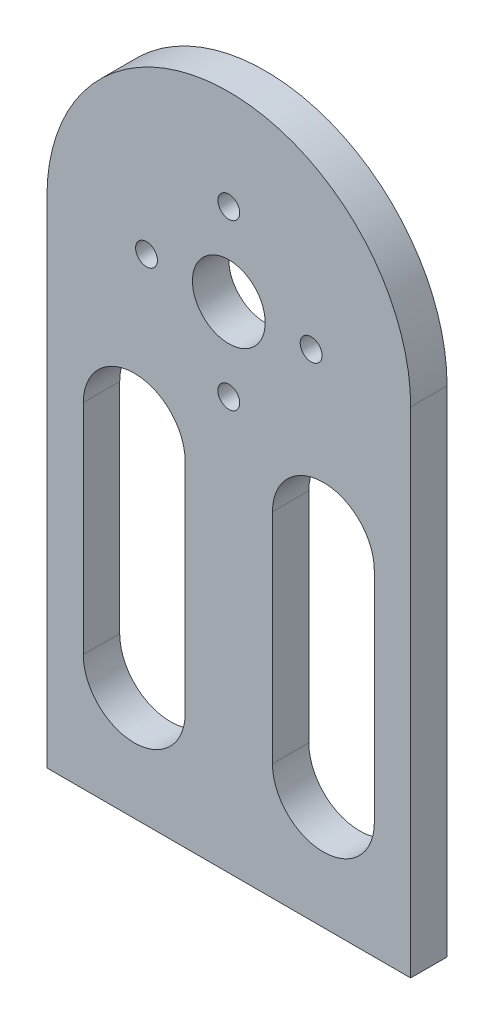
ISO-10303-21;
HEADER;
FILE_DESCRIPTION(('STEP AP214'),'2;1');
FILE_NAME('part.step','',(''),(''),'','','');
FILE_SCHEMA(('AUTOMOTIVE_DESIGN { 1 0 10303 214 1 1 1 1 }'));
ENDSEC;
DATA;
#1=APPLICATION_CONTEXT('core data for automotive mechanical design processes');
#2=APPLICATION_PROTOCOL_DEFINITION('international standard','automotive_design',2000,#1);
#3=PRODUCT_CONTEXT('',#1,'mechanical');
#4=PRODUCT('Part','Part','',(#3));
#5=PRODUCT_RELATED_PRODUCT_CATEGORY('part','',(#4));
#6=PRODUCT_DEFINITION_FORMATION('','',#4);
#7=PRODUCT_DEFINITION_CONTEXT('part definition',#1,'design');
#8=PRODUCT_DEFINITION('design','',#6,#7);
#9=PRODUCT_DEFINITION_SHAPE('','',#8);
#10=(LENGTH_UNIT() NAMED_UNIT(*) SI_UNIT(.MILLI.,.METRE.));
#11=(NAMED_UNIT(*) PLANE_ANGLE_UNIT() SI_UNIT($,.RADIAN.));
#12=(NAMED_UNIT(*) SI_UNIT($,.STERADIAN.) SOLID_ANGLE_UNIT());
#13=UNCERTAINTY_MEASURE_WITH_UNIT(LENGTH_MEASURE(1.E-05),#10,'distance_accuracy_value','');
#14=(GEOMETRIC_REPRESENTATION_CONTEXT(3) GLOBAL_UNCERTAINTY_ASSIGNED_CONTEXT((#13)) GLOBAL_UNIT_ASSIGNED_CONTEXT((#10,
#11,#12)) REPRESENTATION_CONTEXT('',''));
#15=CARTESIAN_POINT('',(0.,0.,0.));
#16=DIRECTION('',(0.,0.,1.));
#17=DIRECTION('',(1.,0.,0.));
#18=AXIS2_PLACEMENT_3D('',#15,#16,#17);
#19=CARTESIAN_POINT('',(0.,34.,2.5));
#20=DIRECTION('',(0.,0.,1.));
#21=DIRECTION('',(1.,0.,0.));
#22=AXIS2_PLACEMENT_3D('',#19,#20,#21);
#23=PLANE('',#22);
#24=CARTESIAN_POINT('',(0.,28.3431457505076,2.5));
#25=DIRECTION('',(0.,0.,1.));
#26=DIRECTION('',(1.,0.,0.));
#27=AXIS2_PLACEMENT_3D('',#24,#25,#26);
#28=CIRCLE('',#27,0.75);
#29=CARTESIAN_POINT('',(0.750000000000001,28.3431457505076,2.5));
#30=VERTEX_POINT('',#29);
#31=EDGE_CURVE('E163',#30,#30,#28,.T.);
#32=ORIENTED_EDGE('',*,*,#31,.F.);
#33=EDGE_LOOP('',(#32));
#34=FACE_BOUND('',#33,.T.);
#35=CARTESIAN_POINT('',(0.,39.6568542494924,2.5));
#36=DIRECTION('',(0.,0.,1.));
#37=DIRECTION('',(1.,0.,0.));
#38=AXIS2_PLACEMENT_3D('',#35,#36,#37);
#39=CIRCLE('',#38,0.750000000000001);
#40=CARTESIAN_POINT('',(0.750000000000001,39.6568542494924,2.5));
#41=VERTEX_POINT('',#40);
#42=EDGE_CURVE('E175',#41,#41,#39,.T.);
#43=ORIENTED_EDGE('',*,*,#42,.F.);
#44=EDGE_LOOP('',(#43));
#45=FACE_BOUND('',#44,.T.);
#46=DIRECTION('',(0.,-1.,0.));
#47=VECTOR('',#46,1.);
#48=CARTESIAN_POINT('',(-10.,23.,2.5));
#49=LINE('',#48,#47);
#50=CARTESIAN_POINT('',(-10.,23.,2.5));
#51=VERTEX_POINT('',#50);
#52=CARTESIAN_POINT('',(-10.,8.,2.5));
#53=VERTEX_POINT('',#52);
#54=EDGE_CURVE('E189',#51,#53,#49,.T.);
#55=ORIENTED_EDGE('',*,*,#54,.F.);
#56=CARTESIAN_POINT('',(-6.5,23.,2.5));
#57=DIRECTION('',(0.,0.,1.));
#58=DIRECTION('',(1.,0.,0.));
#59=AXIS2_PLACEMENT_3D('',#56,#57,#58);
#60=CIRCLE('',#59,3.5);
#61=CARTESIAN_POINT('',(-3.,23.,2.5));
#62=VERTEX_POINT('',#61);
#63=EDGE_CURVE('E187',#62,#51,#60,.T.);
#64=ORIENTED_EDGE('',*,*,#63,.F.);
#65=DIRECTION('',(0.,1.,0.));
#66=VECTOR('',#65,1.);
#67=CARTESIAN_POINT('',(-3.,23.,2.5));
#68=LINE('',#67,#66);
#69=CARTESIAN_POINT('',(-3.,8.,2.5));
#70=VERTEX_POINT('',#69);
#71=EDGE_CURVE('E195',#70,#62,#68,.T.);
#72=ORIENTED_EDGE('',*,*,#71,.F.);
#73=CARTESIAN_POINT('',(-6.5,8.,2.5));
#74=DIRECTION('',(0.,0.,1.));
#75=DIRECTION('',(1.,0.,0.));
#76=AXIS2_PLACEMENT_3D('',#73,#74,#75);
#77=CIRCLE('',#76,3.5);
#78=EDGE_CURVE('E192',#53,#70,#77,.T.);
#79=ORIENTED_EDGE('',*,*,#78,.F.);
#80=EDGE_LOOP('',(#55,#64,#72,#79));
#81=FACE_BOUND('',#80,.T.);
#82=CARTESIAN_POINT('',(0.,34.,2.5));
#83=DIRECTION('',(0.,0.,1.));
#84=DIRECTION('',(1.,0.,0.));
#85=AXIS2_PLACEMENT_3D('',#82,#83,#84);
#86=CIRCLE('',#85,12.5);
#87=CARTESIAN_POINT('',(12.5,34.,2.5));
#88=VERTEX_POINT('',#87);
#89=CARTESIAN_POINT('',(-12.5,34.,2.5));
#90=VERTEX_POINT('',#89);
#91=EDGE_CURVE('E218',#88,#90,#86,.T.);
#92=ORIENTED_EDGE('',*,*,#91,.T.);
#93=DIRECTION('',(0.,-1.,0.));
#94=VECTOR('',#93,1.);
#95=CARTESIAN_POINT('',(-12.5,34.,2.5));
#96=LINE('',#95,#94);
#97=CARTESIAN_POINT('',(-12.5,0.,2.5));
#98=VERTEX_POINT('',#97);
#99=EDGE_CURVE('E221',#90,#98,#96,.T.);
#100=ORIENTED_EDGE('',*,*,#99,.T.);
#101=DIRECTION('',(1.,0.,0.));
#102=VECTOR('',#101,1.);
#103=CARTESIAN_POINT('',(-12.5,0.,2.5));
#104=LINE('',#103,#102);
#105=CARTESIAN_POINT('',(12.5,0.,2.5));
#106=VERTEX_POINT('',#105);
#107=EDGE_CURVE('E224',#98,#106,#104,.T.);
#108=ORIENTED_EDGE('',*,*,#107,.T.);
#109=DIRECTION('',(0.,1.,0.));
#110=VECTOR('',#109,1.);
#111=CARTESIAN_POINT('',(12.5,34.,2.5));
#112=LINE('',#111,#110);
#113=EDGE_CURVE('E226',#106,#88,#112,.T.);
#114=ORIENTED_EDGE('',*,*,#113,.T.);
#115=EDGE_LOOP('',(#92,#100,#108,#114));
#116=FACE_BOUND('',#115,.T.);
#117=CARTESIAN_POINT('',(0.,34.,2.5));
#118=DIRECTION('',(0.,0.,1.));
#119=DIRECTION('',(1.,0.,0.));
#120=AXIS2_PLACEMENT_3D('',#117,#118,#119);
#121=CIRCLE('',#120,2.5);
#122=CARTESIAN_POINT('',(2.5,34.,2.5));
#123=VERTEX_POINT('',#122);
#124=EDGE_CURVE('E181',#123,#123,#121,.T.);
#125=ORIENTED_EDGE('',*,*,#124,.F.);
#126=EDGE_LOOP('',(#125));
#127=FACE_BOUND('',#126,.T.);
#128=CARTESIAN_POINT('',(5.65685424949238,34.,2.5));
#129=DIRECTION('',(0.,0.,1.));
#130=DIRECTION('',(1.,0.,0.));
#131=AXIS2_PLACEMENT_3D('',#128,#129,#130);
#132=CIRCLE('',#131,0.75);
#133=CARTESIAN_POINT('',(6.40685424949238,34.,2.5));
#134=VERTEX_POINT('',#133);
#135=EDGE_CURVE('E169',#134,#134,#132,.T.);
#136=ORIENTED_EDGE('',*,*,#135,.F.);
#137=EDGE_LOOP('',(#136));
#138=FACE_BOUND('',#137,.T.);
#139=CARTESIAN_POINT('',(-5.65685424949238,34.,2.5));
#140=DIRECTION('',(0.,0.,1.));
#141=DIRECTION('',(1.,0.,0.));
#142=AXIS2_PLACEMENT_3D('',#139,#140,#141);
#143=CIRCLE('',#142,0.750000000000003);
#144=CARTESIAN_POINT('',(-4.90685424949238,34.,2.5));
#145=VERTEX_POINT('',#144);
#146=EDGE_CURVE('E157',#145,#145,#143,.T.);
#147=ORIENTED_EDGE('',*,*,#146,.F.);
#148=EDGE_LOOP('',(#147));
#149=FACE_BOUND('',#148,.T.);
#150=DIRECTION('',(0.,-1.,0.));
#151=VECTOR('',#150,1.);
#152=CARTESIAN_POINT('',(3.,23.,2.5));
#153=LINE('',#152,#151);
#154=CARTESIAN_POINT('',(3.,23.,2.5));
#155=VERTEX_POINT('',#154);
#156=CARTESIAN_POINT('',(3.,8.,2.5));
#157=VERTEX_POINT('',#156);
#158=EDGE_CURVE('E129',#155,#157,#153,.T.);
#159=ORIENTED_EDGE('',*,*,#158,.F.);
#160=CARTESIAN_POINT('',(6.5,23.,2.5));
#161=DIRECTION('',(0.,0.,1.));
#162=DIRECTION('',(-1.,0.,0.));
#163=AXIS2_PLACEMENT_3D('',#160,#161,#162);
#164=CIRCLE('',#163,3.5);
#165=CARTESIAN_POINT('',(10.,23.,2.5));
#166=VERTEX_POINT('',#165);
#167=EDGE_CURVE('E121',#166,#155,#164,.T.);
#168=ORIENTED_EDGE('',*,*,#167,.F.);
#169=DIRECTION('',(0.,1.,0.));
#170=VECTOR('',#169,1.);
#171=CARTESIAN_POINT('',(10.,23.,2.5));
#172=LINE('',#171,#170);
#173=CARTESIAN_POINT('',(10.,8.,2.5));
#174=VERTEX_POINT('',#173);
#175=EDGE_CURVE('E143',#174,#166,#172,.T.);
#176=ORIENTED_EDGE('',*,*,#175,.F.);
#177=CARTESIAN_POINT('',(6.5,8.,2.5));
#178=DIRECTION('',(0.,0.,1.));
#179=DIRECTION('',(-1.,0.,0.));
#180=AXIS2_PLACEMENT_3D('',#177,#178,#179);
#181=CIRCLE('',#180,3.5);
#182=EDGE_CURVE('E141',#157,#174,#181,.T.);
#183=ORIENTED_EDGE('',*,*,#182,.F.);
#184=EDGE_LOOP('',(#159,#168,#176,#183));
#185=FACE_BOUND('',#184,.T.);
#186=ADVANCED_FACE('F32',(#34,#45,#81,#116,#127,#138,#149,#185),#23,.T.);
#187=CARTESIAN_POINT('',(0.,34.,0.));
#188=DIRECTION('',(0.,0.,1.));
#189=DIRECTION('',(1.,0.,0.));
#190=AXIS2_PLACEMENT_3D('',#187,#188,#189);
#191=PLANE('',#190);
#192=CARTESIAN_POINT('',(-5.65685424949238,34.,0.));
#193=DIRECTION('',(0.,0.,1.));
#194=DIRECTION('',(1.,0.,0.));
#195=AXIS2_PLACEMENT_3D('',#192,#193,#194);
#196=CIRCLE('',#195,0.750000000000003);
#197=CARTESIAN_POINT('',(-4.90685424949238,34.,0.));
#198=VERTEX_POINT('',#197);
#199=EDGE_CURVE('E137',#198,#198,#196,.T.);
#200=ORIENTED_EDGE('',*,*,#199,.T.);
#201=EDGE_LOOP('',(#200));
#202=FACE_BOUND('',#201,.T.);
#203=CARTESIAN_POINT('',(0.,28.3431457505076,0.));
#204=DIRECTION('',(0.,0.,1.));
#205=DIRECTION('',(1.,0.,0.));
#206=AXIS2_PLACEMENT_3D('',#203,#204,#205);
#207=CIRCLE('',#206,0.75);
#208=CARTESIAN_POINT('',(0.750000000000001,28.3431457505076,0.));
#209=VERTEX_POINT('',#208);
#210=EDGE_CURVE('E160',#209,#209,#207,.T.);
#211=ORIENTED_EDGE('',*,*,#210,.T.);
#212=EDGE_LOOP('',(#211));
#213=FACE_BOUND('',#212,.T.);
#214=CARTESIAN_POINT('',(5.65685424949238,34.,0.));
#215=DIRECTION('',(0.,0.,1.));
#216=DIRECTION('',(1.,0.,0.));
#217=AXIS2_PLACEMENT_3D('',#214,#215,#216);
#218=CIRCLE('',#217,0.75);
#219=CARTESIAN_POINT('',(6.40685424949238,34.,0.));
#220=VERTEX_POINT('',#219);
#221=EDGE_CURVE('E166',#220,#220,#218,.T.);
#222=ORIENTED_EDGE('',*,*,#221,.T.);
#223=EDGE_LOOP('',(#222));
#224=FACE_BOUND('',#223,.T.);
#225=CARTESIAN_POINT('',(0.,39.6568542494924,0.));
#226=DIRECTION('',(0.,0.,1.));
#227=DIRECTION('',(1.,0.,0.));
#228=AXIS2_PLACEMENT_3D('',#225,#226,#227);
#229=CIRCLE('',#228,0.750000000000001);
#230=CARTESIAN_POINT('',(0.750000000000001,39.6568542494924,0.));
#231=VERTEX_POINT('',#230);
#232=EDGE_CURVE('E172',#231,#231,#229,.T.);
#233=ORIENTED_EDGE('',*,*,#232,.T.);
#234=EDGE_LOOP('',(#233));
#235=FACE_BOUND('',#234,.T.);
#236=CARTESIAN_POINT('',(0.,34.,0.));
#237=DIRECTION('',(0.,0.,1.));
#238=DIRECTION('',(1.,0.,0.));
#239=AXIS2_PLACEMENT_3D('',#236,#237,#238);
#240=CIRCLE('',#239,2.5);
#241=CARTESIAN_POINT('',(2.5,34.,0.));
#242=VERTEX_POINT('',#241);
#243=EDGE_CURVE('E178',#242,#242,#240,.T.);
#244=ORIENTED_EDGE('',*,*,#243,.T.);
#245=EDGE_LOOP('',(#244));
#246=FACE_BOUND('',#245,.T.);
#247=CARTESIAN_POINT('',(-6.5,23.,0.));
#248=DIRECTION('',(0.,0.,1.));
#249=DIRECTION('',(1.,0.,0.));
#250=AXIS2_PLACEMENT_3D('',#247,#248,#249);
#251=CIRCLE('',#250,3.5);
#252=CARTESIAN_POINT('',(-3.,23.,0.));
#253=VERTEX_POINT('',#252);
#254=CARTESIAN_POINT('',(-10.,23.,0.));
#255=VERTEX_POINT('',#254);
#256=EDGE_CURVE('E184',#253,#255,#251,.T.);
#257=ORIENTED_EDGE('',*,*,#256,.T.);
#258=DIRECTION('',(0.,-1.,0.));
#259=VECTOR('',#258,1.);
#260=CARTESIAN_POINT('',(-10.,23.,0.));
#261=LINE('',#260,#259);
#262=CARTESIAN_POINT('',(-10.,8.,0.));
#263=VERTEX_POINT('',#262);
#264=EDGE_CURVE('E200',#255,#263,#261,.T.);
#265=ORIENTED_EDGE('',*,*,#264,.T.);
#266=CARTESIAN_POINT('',(-6.5,8.,0.));
#267=DIRECTION('',(0.,0.,1.));
#268=DIRECTION('',(1.,0.,0.));
#269=AXIS2_PLACEMENT_3D('',#266,#267,#268);
#270=CIRCLE('',#269,3.5);
#271=CARTESIAN_POINT('',(-3.,8.,0.));
#272=VERTEX_POINT('',#271);
#273=EDGE_CURVE('E203',#263,#272,#270,.T.);
#274=ORIENTED_EDGE('',*,*,#273,.T.);
#275=DIRECTION('',(0.,1.,0.));
#276=VECTOR('',#275,1.);
#277=CARTESIAN_POINT('',(-3.,23.,0.));
#278=LINE('',#277,#276);
#279=EDGE_CURVE('E190',#272,#253,#278,.T.);
#280=ORIENTED_EDGE('',*,*,#279,.T.);
#281=EDGE_LOOP('',(#257,#265,#274,#280));
#282=FACE_BOUND('',#281,.T.);
#283=CARTESIAN_POINT('',(0.,34.,0.));
#284=DIRECTION('',(0.,0.,1.));
#285=DIRECTION('',(1.,0.,0.));
#286=AXIS2_PLACEMENT_3D('',#283,#284,#285);
#287=CIRCLE('',#286,12.5);
#288=CARTESIAN_POINT('',(12.5,34.,0.));
#289=VERTEX_POINT('',#288);
#290=CARTESIAN_POINT('',(-12.5,34.,0.));
#291=VERTEX_POINT('',#290);
#292=EDGE_CURVE('E217',#289,#291,#287,.T.);
#293=ORIENTED_EDGE('',*,*,#292,.F.);
#294=DIRECTION('',(0.,1.,0.));
#295=VECTOR('',#294,1.);
#296=CARTESIAN_POINT('',(12.5,34.,0.));
#297=LINE('',#296,#295);
#298=CARTESIAN_POINT('',(12.5,0.,0.));
#299=VERTEX_POINT('',#298);
#300=EDGE_CURVE('E222',#299,#289,#297,.T.);
#301=ORIENTED_EDGE('',*,*,#300,.F.);
#302=DIRECTION('',(1.,0.,0.));
#303=VECTOR('',#302,1.);
#304=CARTESIAN_POINT('',(-12.5,0.,0.));
#305=LINE('',#304,#303);
#306=CARTESIAN_POINT('',(-12.5,0.,0.));
#307=VERTEX_POINT('',#306);
#308=EDGE_CURVE('E233',#307,#299,#305,.T.);
#309=ORIENTED_EDGE('',*,*,#308,.F.);
#310=DIRECTION('',(0.,-1.,0.));
#311=VECTOR('',#310,1.);
#312=CARTESIAN_POINT('',(-12.5,34.,0.));
#313=LINE('',#312,#311);
#314=EDGE_CURVE('E231',#291,#307,#313,.T.);
#315=ORIENTED_EDGE('',*,*,#314,.F.);
#316=EDGE_LOOP('',(#293,#301,#309,#315));
#317=FACE_BOUND('',#316,.T.);
#318=CARTESIAN_POINT('',(6.5,23.,0.));
#319=DIRECTION('',(0.,0.,1.));
#320=DIRECTION('',(-1.,0.,0.));
#321=AXIS2_PLACEMENT_3D('',#318,#319,#320);
#322=CIRCLE('',#321,3.5);
#323=CARTESIAN_POINT('',(10.,23.,0.));
#324=VERTEX_POINT('',#323);
#325=CARTESIAN_POINT('',(3.,23.,0.));
#326=VERTEX_POINT('',#325);
#327=EDGE_CURVE('E55',#324,#326,#322,.T.);
#328=ORIENTED_EDGE('',*,*,#327,.T.);
#329=DIRECTION('',(0.,-1.,0.));
#330=VECTOR('',#329,1.);
#331=CARTESIAN_POINT('',(3.,23.,0.));
#332=LINE('',#331,#330);
#333=CARTESIAN_POINT('',(3.,8.,0.));
#334=VERTEX_POINT('',#333);
#335=EDGE_CURVE('E136',#326,#334,#332,.T.);
#336=ORIENTED_EDGE('',*,*,#335,.T.);
#337=CARTESIAN_POINT('',(6.5,8.,0.));
#338=DIRECTION('',(0.,0.,1.));
#339=DIRECTION('',(-1.,0.,0.));
#340=AXIS2_PLACEMENT_3D('',#337,#338,#339);
#341=CIRCLE('',#340,3.5);
#342=CARTESIAN_POINT('',(10.,8.,0.));
#343=VERTEX_POINT('',#342);
#344=EDGE_CURVE('E149',#334,#343,#341,.T.);
#345=ORIENTED_EDGE('',*,*,#344,.T.);
#346=DIRECTION('',(0.,1.,0.));
#347=VECTOR('',#346,1.);
#348=CARTESIAN_POINT('',(10.,23.,0.));
#349=LINE('',#348,#347);
#350=EDGE_CURVE('E130',#343,#324,#349,.T.);
#351=ORIENTED_EDGE('',*,*,#350,.T.);
#352=EDGE_LOOP('',(#328,#336,#345,#351));
#353=FACE_BOUND('',#352,.T.);
#354=ADVANCED_FACE('F251',(#202,#213,#224,#235,#246,#282,#317,#353),#191,.F.);
#355=CARTESIAN_POINT('',(0.,34.,2.5));
#356=DIRECTION('',(0.,0.,-1.));
#357=DIRECTION('',(-1.,0.,0.));
#358=AXIS2_PLACEMENT_3D('',#355,#356,#357);
#359=CYLINDRICAL_SURFACE('',#358,12.5);
#360=ORIENTED_EDGE('',*,*,#292,.T.);
#361=DIRECTION('',(0.,0.,-1.));
#362=VECTOR('',#361,1.);
#363=CARTESIAN_POINT('',(-12.5,34.,2.5));
#364=LINE('',#363,#362);
#365=EDGE_CURVE('E11',#90,#291,#364,.T.);
#366=ORIENTED_EDGE('',*,*,#365,.F.);
#367=ORIENTED_EDGE('',*,*,#91,.F.);
#368=DIRECTION('',(0.,0.,-1.));
#369=VECTOR('',#368,1.);
#370=CARTESIAN_POINT('',(12.5,34.,2.5));
#371=LINE('',#370,#369);
#372=EDGE_CURVE('E228',#88,#289,#371,.T.);
#373=ORIENTED_EDGE('',*,*,#372,.T.);
#374=EDGE_LOOP('',(#360,#366,#367,#373));
#375=FACE_BOUND('',#374,.T.);
#376=ADVANCED_FACE('F34',(#375),#359,.T.);
#377=CARTESIAN_POINT('',(-12.5,34.,2.5));
#378=DIRECTION('',(1.,0.,0.));
#379=DIRECTION('',(0.,1.,0.));
#380=AXIS2_PLACEMENT_3D('',#377,#378,#379);
#381=PLANE('',#380);
#382=ORIENTED_EDGE('',*,*,#314,.T.);
#383=DIRECTION('',(0.,0.,-1.));
#384=VECTOR('',#383,1.);
#385=CARTESIAN_POINT('',(-12.5,0.,2.5));
#386=LINE('',#385,#384);
#387=EDGE_CURVE('E40',#98,#307,#386,.T.);
#388=ORIENTED_EDGE('',*,*,#387,.F.);
#389=ORIENTED_EDGE('',*,*,#99,.F.);
#390=ORIENTED_EDGE('',*,*,#365,.T.);
#391=EDGE_LOOP('',(#382,#388,#389,#390));
#392=FACE_BOUND('',#391,.T.);
#393=ADVANCED_FACE('F262',(#392),#381,.F.);
#394=CARTESIAN_POINT('',(-12.5,0.,2.5));
#395=DIRECTION('',(0.,1.,0.));
#396=DIRECTION('',(0.,0.,1.));
#397=AXIS2_PLACEMENT_3D('',#394,#395,#396);
#398=PLANE('',#397);
#399=ORIENTED_EDGE('',*,*,#308,.T.);
#400=DIRECTION('',(0.,0.,-1.));
#401=VECTOR('',#400,1.);
#402=CARTESIAN_POINT('',(12.5,0.,2.5));
#403=LINE('',#402,#401);
#404=EDGE_CURVE('E238',#106,#299,#403,.T.);
#405=ORIENTED_EDGE('',*,*,#404,.F.);
#406=ORIENTED_EDGE('',*,*,#107,.F.);
#407=ORIENTED_EDGE('',*,*,#387,.T.);
#408=EDGE_LOOP('',(#399,#405,#406,#407));
#409=FACE_BOUND('',#408,.T.);
#410=ADVANCED_FACE('F245',(#409),#398,.F.);
#411=CARTESIAN_POINT('',(12.5,34.,2.5));
#412=DIRECTION('',(-1.,0.,0.));
#413=DIRECTION('',(0.,-1.,0.));
#414=AXIS2_PLACEMENT_3D('',#411,#412,#413);
#415=PLANE('',#414);
#416=ORIENTED_EDGE('',*,*,#300,.T.);
#417=ORIENTED_EDGE('',*,*,#372,.F.);
#418=ORIENTED_EDGE('',*,*,#113,.F.);
#419=ORIENTED_EDGE('',*,*,#404,.T.);
#420=EDGE_LOOP('',(#416,#417,#418,#419));
#421=FACE_BOUND('',#420,.T.);
#422=ADVANCED_FACE('F255',(#421),#415,.F.);
#423=CARTESIAN_POINT('',(-6.5,23.,2.5));
#424=DIRECTION('',(0.,0.,-1.));
#425=DIRECTION('',(-1.,0.,0.));
#426=AXIS2_PLACEMENT_3D('',#423,#424,#425);
#427=CYLINDRICAL_SURFACE('',#426,3.5);
#428=ORIENTED_EDGE('',*,*,#256,.F.);
#429=DIRECTION('',(0.,0.,-1.));
#430=VECTOR('',#429,1.);
#431=CARTESIAN_POINT('',(-3.,23.,2.5));
#432=LINE('',#431,#430);
#433=EDGE_CURVE('E197',#62,#253,#432,.T.);
#434=ORIENTED_EDGE('',*,*,#433,.F.);
#435=ORIENTED_EDGE('',*,*,#63,.T.);
#436=DIRECTION('',(0.,0.,-1.));
#437=VECTOR('',#436,1.);
#438=CARTESIAN_POINT('',(-10.,23.,2.5));
#439=LINE('',#438,#437);
#440=EDGE_CURVE('E214',#51,#255,#439,.T.);
#441=ORIENTED_EDGE('',*,*,#440,.T.);
#442=EDGE_LOOP('',(#428,#434,#435,#441));
#443=FACE_BOUND('',#442,.T.);
#444=ADVANCED_FACE('F280',(#443),#427,.F.);
#445=CARTESIAN_POINT('',(-10.,23.,2.5));
#446=DIRECTION('',(1.,0.,0.));
#447=DIRECTION('',(0.,1.,0.));
#448=AXIS2_PLACEMENT_3D('',#445,#446,#447);
#449=PLANE('',#448);
#450=ORIENTED_EDGE('',*,*,#264,.F.);
#451=ORIENTED_EDGE('',*,*,#440,.F.);
#452=ORIENTED_EDGE('',*,*,#54,.T.);
#453=DIRECTION('',(0.,0.,-1.));
#454=VECTOR('',#453,1.);
#455=CARTESIAN_POINT('',(-10.,8.,2.5));
#456=LINE('',#455,#454);
#457=EDGE_CURVE('E212',#53,#263,#456,.T.);
#458=ORIENTED_EDGE('',*,*,#457,.T.);
#459=EDGE_LOOP('',(#450,#451,#452,#458));
#460=FACE_BOUND('',#459,.T.);
#461=ADVANCED_FACE('F287',(#460),#449,.T.);
#462=CARTESIAN_POINT('',(-6.5,8.,2.5));
#463=DIRECTION('',(0.,0.,-1.));
#464=DIRECTION('',(-1.,0.,0.));
#465=AXIS2_PLACEMENT_3D('',#462,#463,#464);
#466=CYLINDRICAL_SURFACE('',#465,3.5);
#467=ORIENTED_EDGE('',*,*,#273,.F.);
#468=ORIENTED_EDGE('',*,*,#457,.F.);
#469=ORIENTED_EDGE('',*,*,#78,.T.);
#470=DIRECTION('',(0.,0.,-1.));
#471=VECTOR('',#470,1.);
#472=CARTESIAN_POINT('',(-3.,8.,2.5));
#473=LINE('',#472,#471);
#474=EDGE_CURVE('E210',#70,#272,#473,.T.);
#475=ORIENTED_EDGE('',*,*,#474,.T.);
#476=EDGE_LOOP('',(#467,#468,#469,#475));
#477=FACE_BOUND('',#476,.T.);
#478=ADVANCED_FACE('F292',(#477),#466,.F.);
#479=CARTESIAN_POINT('',(-3.,23.,2.5));
#480=DIRECTION('',(-1.,0.,0.));
#481=DIRECTION('',(0.,-1.,0.));
#482=AXIS2_PLACEMENT_3D('',#479,#480,#481);
#483=PLANE('',#482);
#484=ORIENTED_EDGE('',*,*,#279,.F.);
#485=ORIENTED_EDGE('',*,*,#474,.F.);
#486=ORIENTED_EDGE('',*,*,#71,.T.);
#487=ORIENTED_EDGE('',*,*,#433,.T.);
#488=EDGE_LOOP('',(#484,#485,#486,#487));
#489=FACE_BOUND('',#488,.T.);
#490=ADVANCED_FACE('F300',(#489),#483,.T.);
#491=CARTESIAN_POINT('',(0.,34.,2.5));
#492=DIRECTION('',(0.,0.,-1.));
#493=DIRECTION('',(-1.,0.,0.));
#494=AXIS2_PLACEMENT_3D('',#491,#492,#493);
#495=CYLINDRICAL_SURFACE('',#494,2.5);
#496=ORIENTED_EDGE('',*,*,#124,.T.);
#497=EDGE_LOOP('',(#496));
#498=FACE_BOUND('',#497,.T.);
#499=ORIENTED_EDGE('',*,*,#243,.F.);
#500=EDGE_LOOP('',(#499));
#501=FACE_BOUND('',#500,.T.);
#502=ADVANCED_FACE('F313',(#498,#501),#495,.F.);
#503=CARTESIAN_POINT('',(0.,39.6568542494924,2.5));
#504=DIRECTION('',(0.,0.,-1.));
#505=DIRECTION('',(-1.,0.,0.));
#506=AXIS2_PLACEMENT_3D('',#503,#504,#505);
#507=CYLINDRICAL_SURFACE('',#506,0.750000000000001);
#508=ORIENTED_EDGE('',*,*,#42,.T.);
#509=EDGE_LOOP('',(#508));
#510=FACE_BOUND('',#509,.T.);
#511=ORIENTED_EDGE('',*,*,#232,.F.);
#512=EDGE_LOOP('',(#511));
#513=FACE_BOUND('',#512,.T.);
#514=ADVANCED_FACE('F318',(#510,#513),#507,.F.);
#515=CARTESIAN_POINT('',(5.65685424949238,34.,2.5));
#516=DIRECTION('',(0.,0.,-1.));
#517=DIRECTION('',(-1.,0.,0.));
#518=AXIS2_PLACEMENT_3D('',#515,#516,#517);
#519=CYLINDRICAL_SURFACE('',#518,0.75);
#520=ORIENTED_EDGE('',*,*,#135,.T.);
#521=EDGE_LOOP('',(#520));
#522=FACE_BOUND('',#521,.T.);
#523=ORIENTED_EDGE('',*,*,#221,.F.);
#524=EDGE_LOOP('',(#523));
#525=FACE_BOUND('',#524,.T.);
#526=ADVANCED_FACE('F322',(#522,#525),#519,.F.);
#527=CARTESIAN_POINT('',(0.,28.3431457505076,2.5));
#528=DIRECTION('',(0.,0.,-1.));
#529=DIRECTION('',(-1.,0.,0.));
#530=AXIS2_PLACEMENT_3D('',#527,#528,#529);
#531=CYLINDRICAL_SURFACE('',#530,0.75);
#532=ORIENTED_EDGE('',*,*,#31,.T.);
#533=EDGE_LOOP('',(#532));
#534=FACE_BOUND('',#533,.T.);
#535=ORIENTED_EDGE('',*,*,#210,.F.);
#536=EDGE_LOOP('',(#535));
#537=FACE_BOUND('',#536,.T.);
#538=ADVANCED_FACE('F326',(#534,#537),#531,.F.);
#539=CARTESIAN_POINT('',(-5.65685424949238,34.,2.5));
#540=DIRECTION('',(0.,0.,-1.));
#541=DIRECTION('',(-1.,0.,0.));
#542=AXIS2_PLACEMENT_3D('',#539,#540,#541);
#543=CYLINDRICAL_SURFACE('',#542,0.750000000000003);
#544=ORIENTED_EDGE('',*,*,#146,.T.);
#545=EDGE_LOOP('',(#544));
#546=FACE_BOUND('',#545,.T.);
#547=ORIENTED_EDGE('',*,*,#199,.F.);
#548=EDGE_LOOP('',(#547));
#549=FACE_BOUND('',#548,.T.);
#550=ADVANCED_FACE('F330',(#546,#549),#543,.F.);
#551=CARTESIAN_POINT('',(6.5,23.,2.5));
#552=DIRECTION('',(0.,0.,-1.));
#553=DIRECTION('',(-1.,0.,0.));
#554=AXIS2_PLACEMENT_3D('',#551,#552,#553);
#555=CYLINDRICAL_SURFACE('',#554,3.5);
#556=ORIENTED_EDGE('',*,*,#327,.F.);
#557=DIRECTION('',(0.,0.,-1.));
#558=VECTOR('',#557,1.);
#559=CARTESIAN_POINT('',(10.,23.,2.5));
#560=LINE('',#559,#558);
#561=EDGE_CURVE('E125',#166,#324,#560,.T.);
#562=ORIENTED_EDGE('',*,*,#561,.F.);
#563=ORIENTED_EDGE('',*,*,#167,.T.);
#564=DIRECTION('',(0.,0.,-1.));
#565=VECTOR('',#564,1.);
#566=CARTESIAN_POINT('',(3.,23.,2.5));
#567=LINE('',#566,#565);
#568=EDGE_CURVE('E124',#155,#326,#567,.T.);
#569=ORIENTED_EDGE('',*,*,#568,.T.);
#570=EDGE_LOOP('',(#556,#562,#563,#569));
#571=FACE_BOUND('',#570,.T.);
#572=ADVANCED_FACE('F123',(#571),#555,.F.);
#573=CARTESIAN_POINT('',(3.,23.,2.5));
#574=DIRECTION('',(1.,0.,0.));
#575=DIRECTION('',(0.,1.,0.));
#576=AXIS2_PLACEMENT_3D('',#573,#574,#575);
#577=PLANE('',#576);
#578=ORIENTED_EDGE('',*,*,#335,.F.);
#579=ORIENTED_EDGE('',*,*,#568,.F.);
#580=ORIENTED_EDGE('',*,*,#158,.T.);
#581=DIRECTION('',(0.,0.,-1.));
#582=VECTOR('',#581,1.);
#583=CARTESIAN_POINT('',(3.,8.,2.5));
#584=LINE('',#583,#582);
#585=EDGE_CURVE('E138',#157,#334,#584,.T.);
#586=ORIENTED_EDGE('',*,*,#585,.T.);
#587=EDGE_LOOP('',(#578,#579,#580,#586));
#588=FACE_BOUND('',#587,.T.);
#589=ADVANCED_FACE('F133',(#588),#577,.T.);
#590=CARTESIAN_POINT('',(6.5,8.,2.5));
#591=DIRECTION('',(0.,0.,-1.));
#592=DIRECTION('',(-1.,0.,0.));
#593=AXIS2_PLACEMENT_3D('',#590,#591,#592);
#594=CYLINDRICAL_SURFACE('',#593,3.5);
#595=ORIENTED_EDGE('',*,*,#344,.F.);
#596=ORIENTED_EDGE('',*,*,#585,.F.);
#597=ORIENTED_EDGE('',*,*,#182,.T.);
#598=DIRECTION('',(0.,0.,-1.));
#599=VECTOR('',#598,1.);
#600=CARTESIAN_POINT('',(10.,8.,2.5));
#601=LINE('',#600,#599);
#602=EDGE_CURVE('E47',#174,#343,#601,.T.);
#603=ORIENTED_EDGE('',*,*,#602,.T.);
#604=EDGE_LOOP('',(#595,#596,#597,#603));
#605=FACE_BOUND('',#604,.T.);
#606=ADVANCED_FACE('F339',(#605),#594,.F.);
#607=CARTESIAN_POINT('',(10.,23.,2.5));
#608=DIRECTION('',(-1.,0.,0.));
#609=DIRECTION('',(0.,-1.,0.));
#610=AXIS2_PLACEMENT_3D('',#607,#608,#609);
#611=PLANE('',#610);
#612=ORIENTED_EDGE('',*,*,#350,.F.);
#613=ORIENTED_EDGE('',*,*,#602,.F.);
#614=ORIENTED_EDGE('',*,*,#175,.T.);
#615=ORIENTED_EDGE('',*,*,#561,.T.);
#616=EDGE_LOOP('',(#612,#613,#614,#615));
#617=FACE_BOUND('',#616,.T.);
#618=ADVANCED_FACE('F342',(#617),#611,.T.);
#619=CLOSED_SHELL('',(#186,#354,#376,#393,#410,#422,#444,#461,#478,#490,#502,#514,#526,#538,
#550,#572,#589,#606,#618));
#620=MANIFOLD_SOLID_BREP('B2',#619);
#621=ADVANCED_BREP_SHAPE_REPRESENTATION('',(#18,#620),#14);
#622=SHAPE_DEFINITION_REPRESENTATION(#9,#621);
ENDSEC;
END-ISO-10303-21;
